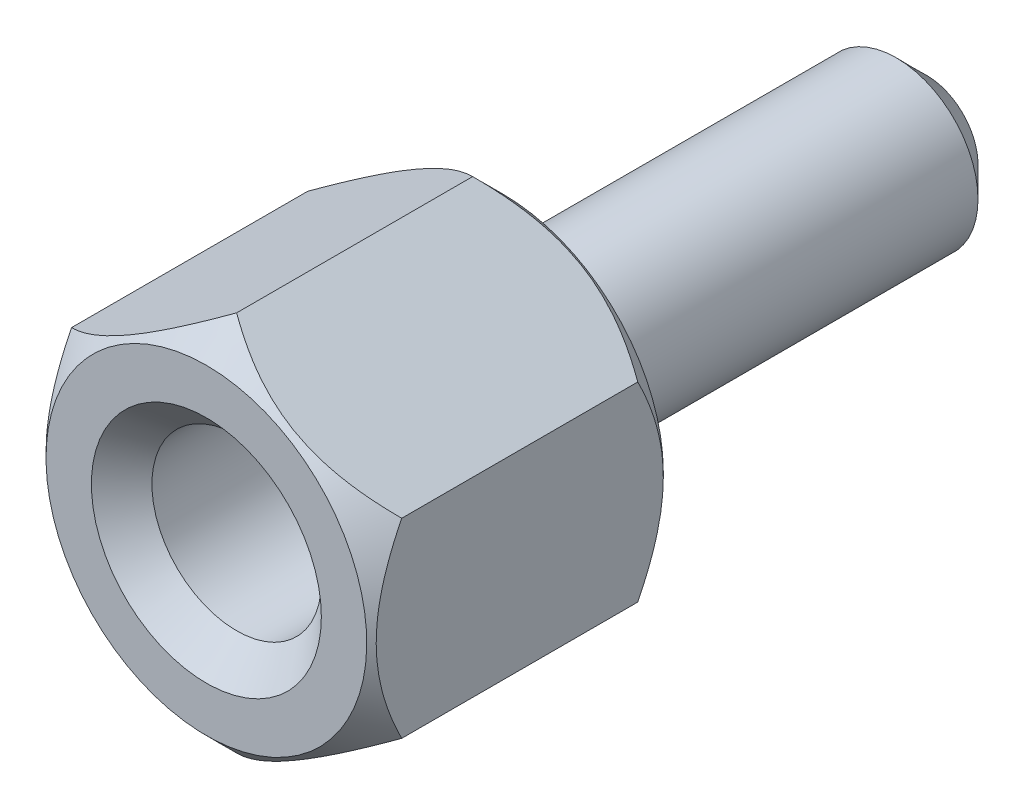
ISO-10303-21;
HEADER;
FILE_DESCRIPTION(('STEP AP214'),'2;1');
FILE_NAME('part.step','',(''),(''),'','','');
FILE_SCHEMA(('AUTOMOTIVE_DESIGN { 1 0 10303 214 1 1 1 1 }'));
ENDSEC;
DATA;
#1=APPLICATION_CONTEXT('core data for automotive mechanical design processes');
#2=APPLICATION_PROTOCOL_DEFINITION('international standard','automotive_design',2000,#1);
#3=PRODUCT_CONTEXT('',#1,'mechanical');
#4=PRODUCT('Part','Part','',(#3));
#5=PRODUCT_RELATED_PRODUCT_CATEGORY('part','',(#4));
#6=PRODUCT_DEFINITION_FORMATION('','',#4);
#7=PRODUCT_DEFINITION_CONTEXT('part definition',#1,'design');
#8=PRODUCT_DEFINITION('design','',#6,#7);
#9=PRODUCT_DEFINITION_SHAPE('','',#8);
#10=(LENGTH_UNIT() NAMED_UNIT(*) SI_UNIT(.MILLI.,.METRE.));
#11=(NAMED_UNIT(*) PLANE_ANGLE_UNIT() SI_UNIT($,.RADIAN.));
#12=(NAMED_UNIT(*) SI_UNIT($,.STERADIAN.) SOLID_ANGLE_UNIT());
#13=UNCERTAINTY_MEASURE_WITH_UNIT(LENGTH_MEASURE(1.E-05),#10,'distance_accuracy_value','');
#14=(GEOMETRIC_REPRESENTATION_CONTEXT(3) GLOBAL_UNCERTAINTY_ASSIGNED_CONTEXT((#13)) GLOBAL_UNIT_ASSIGNED_CONTEXT((#10,
#11,#12)) REPRESENTATION_CONTEXT('',''));
#15=CARTESIAN_POINT('',(0.,0.,0.));
#16=DIRECTION('',(0.,0.,1.));
#17=DIRECTION('',(1.,0.,0.));
#18=AXIS2_PLACEMENT_3D('',#15,#16,#17);
#19=CARTESIAN_POINT('',(0.,0.,0.));
#20=DIRECTION('',(0.,0.,1.));
#21=DIRECTION('',(1.,0.,0.));
#22=AXIS2_PLACEMENT_3D('',#19,#20,#21);
#23=PLANE('',#22);
#24=CARTESIAN_POINT('',(0.,0.,0.));
#25=DIRECTION('',(0.,0.,-1.));
#26=DIRECTION('',(0.,1.,0.));
#27=AXIS2_PLACEMENT_3D('',#24,#25,#26);
#28=CIRCLE('',#27,2.65000000000002);
#29=CARTESIAN_POINT('',(0.,2.65000000000002,0.));
#30=VERTEX_POINT('',#29);
#31=EDGE_CURVE('E93',#30,#30,#28,.T.);
#32=ORIENTED_EDGE('',*,*,#31,.T.);
#33=EDGE_LOOP('',(#32));
#34=FACE_BOUND('',#33,.T.);
#35=CARTESIAN_POINT('',(0.,0.,0.));
#36=DIRECTION('',(0.,0.,1.));
#37=DIRECTION('',(1.,0.,0.));
#38=AXIS2_PLACEMENT_3D('',#35,#36,#37);
#39=CIRCLE('',#38,1.35);
#40=CARTESIAN_POINT('',(1.35,0.,0.));
#41=VERTEX_POINT('',#40);
#42=EDGE_CURVE('E122',#41,#41,#39,.F.);
#43=ORIENTED_EDGE('',*,*,#42,.F.);
#44=EDGE_LOOP('',(#43));
#45=FACE_BOUND('',#44,.T.);
#46=ADVANCED_FACE('F34',(#34,#45),#23,.F.);
#47=CARTESIAN_POINT('',(0.,3.15000000000002,4.9));
#48=DIRECTION('',(0.5,-0.866025403784438,0.));
#49=DIRECTION('',(0.866025403784438,0.5,0.));
#50=AXIS2_PLACEMENT_3D('',#47,#48,#49);
#51=PLANE('',#50);
#52=DIRECTION('',(0.,0.,-1.));
#53=VECTOR('',#52,1.);
#54=CARTESIAN_POINT('',(0.,3.15000000000002,4.9));
#55=LINE('',#54,#53);
#56=CARTESIAN_POINT('',(0.,3.15000000000002,4.4));
#57=VERTEX_POINT('',#56);
#58=CARTESIAN_POINT('',(0.,3.15000000000002,0.5));
#59=VERTEX_POINT('',#58);
#60=EDGE_CURVE('E106',#57,#59,#55,.T.);
#61=ORIENTED_EDGE('',*,*,#60,.T.);
#62=CARTESIAN_POINT('',(0.00020000000000003,3.15011547005385,0.500115476402811));
#63=CARTESIAN_POINT('',(-0.0935740623371885,3.09597498992047,0.446021054080894));
#64=CARTESIAN_POINT('',(-0.188916150852356,3.04092920945114,0.395103669921844));
#65=CARTESIAN_POINT('',(-0.383329160515754,2.92868480598801,0.301875142945967));
#66=CARTESIAN_POINT('',(-0.482418570844896,2.87147550826064,0.259615872312243));
#67=CARTESIAN_POINT('',(-0.682227636576049,2.75611569037423,0.187224912910998));
#68=CARTESIAN_POINT('',(-0.782896405789651,2.69799454936977,0.156911272084789));
#69=CARTESIAN_POINT('',(-0.986450140595693,2.58047274578495,0.11020681833911));
#70=CARTESIAN_POINT('',(-1.08932888791324,2.52107567332727,0.0937811418598558));
#71=CARTESIAN_POINT('',(-1.2666352001601,2.41870782622253,0.0789609255313397));
#72=CARTESIAN_POINT('',(-1.34083370477252,2.37586929961107,0.0767670683546481));
#73=CARTESIAN_POINT('',(-1.48910942261416,2.29026227400092,0.0804631789150768));
#74=CARTESIAN_POINT('',(-1.56318658420821,2.2474938048138,0.0863559806392811));
#75=CARTESIAN_POINT('',(-1.71064144077121,2.16236070368383,0.105890071503692));
#76=CARTESIAN_POINT('',(-1.78401825978317,2.119996577475,0.119540028268319));
#77=CARTESIAN_POINT('',(-1.92950303330313,2.03600090432026,0.153839149904403));
#78=CARTESIAN_POINT('',(-2.00161108464073,1.99436930146975,0.174487778193878));
#79=CARTESIAN_POINT('',(-2.18630711212914,1.88773500028106,0.235786519883825));
#80=CARTESIAN_POINT('',(-2.29774998690544,1.8233934265297,0.281056783854008));
#81=CARTESIAN_POINT('',(-2.46161706493738,1.72878472491664,0.357479001040071));
#82=CARTESIAN_POINT('',(-2.51561859986914,1.69760692418714,0.384330222351851));
#83=CARTESIAN_POINT('',(-2.62262141055367,1.63582882263438,0.440480326653231));
#84=CARTESIAN_POINT('',(-2.67562327613271,1.60522818127476,0.46977770720925));
#85=CARTESIAN_POINT('',(-2.728180021921,1.57488452994617,0.500115476402811));
#86=B_SPLINE_CURVE_WITH_KNOTS('',3,(#62,#63,#64,#65,#66,#67,#68,#69,#70,#71,#72,#73,#74,#75,#76,
#77,#78,#79,#80,#81,#82,#83,#84,#85),.UNSPECIFIED.,.F.,.F.,(4,2,2,2,2,2,2,2,2,2,2,4),(0.,
0.363375135570575,0.728867451458775,1.08855497791733,1.44733686140353,1.70408836341067,
1.96092986751869,2.21805892488537,2.47516827285128,2.88355283411653,3.08719139751492,
3.29070579322517),.UNSPECIFIED.);
#87=CARTESIAN_POINT('',(-2.727980021921,1.57500000000001,0.5));
#88=VERTEX_POINT('',#87);
#89=EDGE_CURVE('E49',#59,#88,#86,.T.);
#90=ORIENTED_EDGE('',*,*,#89,.T.);
#91=DIRECTION('',(0.,0.,-1.));
#92=VECTOR('',#91,1.);
#93=CARTESIAN_POINT('',(-2.727980021921,1.57500000000001,4.9));
#94=LINE('',#93,#92);
#95=CARTESIAN_POINT('',(-2.727980021921,1.57500000000001,4.4));
#96=VERTEX_POINT('',#95);
#97=EDGE_CURVE('E119',#96,#88,#94,.T.);
#98=ORIENTED_EDGE('',*,*,#97,.F.);
#99=CARTESIAN_POINT('',(-2.728180021921,1.57488452994617,4.39988452359719));
#100=CARTESIAN_POINT('',(-2.63440595958381,1.62902501007955,4.45397894591911));
#101=CARTESIAN_POINT('',(-2.53906387106864,1.68407079054888,4.50489633007816));
#102=CARTESIAN_POINT('',(-2.34465086140524,1.79631519401201,4.59812485705404));
#103=CARTESIAN_POINT('',(-2.2455614510761,1.85352449173938,4.64038412768776));
#104=CARTESIAN_POINT('',(-2.04575238534495,1.96888430962579,4.712775087089));
#105=CARTESIAN_POINT('',(-1.94508361613134,2.02700545063025,4.74308872791521));
#106=CARTESIAN_POINT('',(-1.7415298813253,2.14452725421507,4.78979318166089));
#107=CARTESIAN_POINT('',(-1.63865113400775,2.20392432667275,4.80621885814015));
#108=CARTESIAN_POINT('',(-1.4613448217609,2.3062921737775,4.82103907446866));
#109=CARTESIAN_POINT('',(-1.38714631714847,2.34913070038895,4.82323293164535));
#110=CARTESIAN_POINT('',(-1.23887059930684,2.4347377259991,4.81953682108492));
#111=CARTESIAN_POINT('',(-1.16479343771279,2.47750619518623,4.81364401936072));
#112=CARTESIAN_POINT('',(-1.01733858114978,2.5626392963162,4.79410992849631));
#113=CARTESIAN_POINT('',(-0.943961762137827,2.60500342252503,4.78045997173168));
#114=CARTESIAN_POINT('',(-0.798476988617867,2.68899909567977,4.7461608500956));
#115=CARTESIAN_POINT('',(-0.726368937280261,2.73063069853027,4.72551222180612));
#116=CARTESIAN_POINT('',(-0.541672909791851,2.83726499971896,4.66421348011618));
#117=CARTESIAN_POINT('',(-0.430230035015556,2.90160657347032,4.61894321614599));
#118=CARTESIAN_POINT('',(-0.266362956983619,2.99621527508338,4.54252099895993));
#119=CARTESIAN_POINT('',(-0.212361422051855,3.02739307581289,4.51566977764815));
#120=CARTESIAN_POINT('',(-0.105358611367328,3.08917117736564,4.45951967334677));
#121=CARTESIAN_POINT('',(-0.0523567457882833,3.11977181872526,4.43022229279075));
#122=CARTESIAN_POINT('',(0.000200000000000358,3.15011547005385,4.39988452359719));
#123=B_SPLINE_CURVE_WITH_KNOTS('',3,(#99,#100,#101,#102,#103,#104,#105,#106,#107,#108,#109,#110,
#111,#112,#113,#114,#115,#116,#117,#118,#119,#120,#121,#122),.UNSPECIFIED.,.F.,.F.,(4,2,2,2,2,2,
2,2,2,2,2,4),(0.,0.363375135570576,0.728867451458775,1.08855497791733,1.44733686140353,
1.70408836341067,1.96092986751869,2.21805892488537,2.47516827285128,2.88355283411653,
3.08719139751492,3.29070579322517),.UNSPECIFIED.);
#124=EDGE_CURVE('E110',#96,#57,#123,.T.);
#125=ORIENTED_EDGE('',*,*,#124,.T.);
#126=EDGE_LOOP('',(#61,#90,#98,#125));
#127=FACE_BOUND('',#126,.T.);
#128=ADVANCED_FACE('F145',(#127),#51,.F.);
#129=CARTESIAN_POINT('',(-2.727980021921,1.57500000000001,4.9));
#130=DIRECTION('',(1.,0.,0.));
#131=DIRECTION('',(0.,1.,0.));
#132=AXIS2_PLACEMENT_3D('',#129,#130,#131);
#133=PLANE('',#132);
#134=ORIENTED_EDGE('',*,*,#97,.T.);
#135=CARTESIAN_POINT('',(-2.72798002192099,-3.25550092627282,1.59737110233649));
#136=CARTESIAN_POINT('',(-2.72798002192099,-3.17672703612413,1.53700653490704));
#137=CARTESIAN_POINT('',(-2.72798002192099,-3.09752514985828,1.47719164655635));
#138=CARTESIAN_POINT('',(-2.72798002192099,-2.93809173414862,1.35891129956539));
#139=CARTESIAN_POINT('',(-2.72798002192099,-2.85785996255421,1.3004461676753));
#140=CARTESIAN_POINT('',(-2.72798002192099,-2.69560650241239,1.18469928265167));
#141=CARTESIAN_POINT('',(-2.72798002192099,-2.61357577511891,1.12743015823779));
#142=CARTESIAN_POINT('',(-2.72798002192099,-2.44814304631878,1.0149147294072));
#143=CARTESIAN_POINT('',(-2.72798002192099,-2.36474114029252,0.959668285000849));
#144=CARTESIAN_POINT('',(-2.72798002192099,-2.19109976112751,0.848296953107717));
#145=CARTESIAN_POINT('',(-2.72798002192099,-2.10075769177368,0.792331220040253));
#146=CARTESIAN_POINT('',(-2.72798002192099,-1.91798096628315,0.683933267187853));
#147=CARTESIAN_POINT('',(-2.72798002192099,-1.82554658564828,0.63150058576807));
#148=CARTESIAN_POINT('',(-2.72798002192099,-1.63852752147434,0.531262706573098));
#149=CARTESIAN_POINT('',(-2.72798002192099,-1.54394983520687,0.483444555778546));
#150=CARTESIAN_POINT('',(-2.72798002192099,-1.35214037256639,0.393515739329422));
#151=CARTESIAN_POINT('',(-2.72798002192099,-1.25490986351674,0.351402403766129));
#152=CARTESIAN_POINT('',(-2.72798002192099,-1.06696378795049,0.278059768498941));
#153=CARTESIAN_POINT('',(-2.72798002192099,-0.976505946767381,0.246176765984997));
#154=CARTESIAN_POINT('',(-2.72798002192099,-0.79331247640072,0.189654232666876));
#155=CARTESIAN_POINT('',(-2.72798002192099,-0.700576700219763,0.165015170658987));
#156=CARTESIAN_POINT('',(-2.72798002192099,-0.514980391634759,0.124714312550988));
#157=CARTESIAN_POINT('',(-2.72798002192099,-0.422155422993445,0.108891470856186));
#158=CARTESIAN_POINT('',(-2.72798002192099,-0.235386453927744,0.0865485765930817));
#159=CARTESIAN_POINT('',(-2.72798002192099,-0.141442680429051,0.0800266688735655));
#160=CARTESIAN_POINT('',(-2.72798002192099,0.0426636433610052,0.0768260842736425));
#161=CARTESIAN_POINT('',(-2.72798002192099,0.132819286579341,0.0797454926538971));
#162=CARTESIAN_POINT('',(-2.72798002192099,0.312412220997515,0.0943508797582278));
#163=CARTESIAN_POINT('',(-2.72798002192099,0.401849445139263,0.106037667446526));
#164=CARTESIAN_POINT('',(-2.72798002192099,0.580876065124029,0.137719778288632));
#165=CARTESIAN_POINT('',(-2.72798002192099,0.670439311219075,0.157860639965581));
#166=CARTESIAN_POINT('',(-2.72798002192099,0.847589186387221,0.20534609425834));
#167=CARTESIAN_POINT('',(-2.727980021921,0.935175939042079,0.232690235121154));
#168=CARTESIAN_POINT('',(-2.727980021921,1.20597362033415,0.327646900659197));
#169=CARTESIAN_POINT('',(-2.727980021921,1.38547850057989,0.405863405293314));
#170=CARTESIAN_POINT('',(-2.727980021921,1.64818762317084,0.536318768759621));
#171=CARTESIAN_POINT('',(-2.727980021921,1.73482752672893,0.582093890562335));
#172=CARTESIAN_POINT('',(-2.727980021921,1.90614486888383,0.677188081364419));
#173=CARTESIAN_POINT('',(-2.727980021921,1.99082265075555,0.726506524170323));
#174=CARTESIAN_POINT('',(-2.727980021921,2.15430151728724,0.82546714595397));
#175=CARTESIAN_POINT('',(-2.727980021921,2.23318618507311,0.874972807742217));
#176=CARTESIAN_POINT('',(-2.727980021921,2.3896021264157,0.976088076646995));
#177=CARTESIAN_POINT('',(-2.727980021921,2.46713329765781,1.02769784184346));
#178=CARTESIAN_POINT('',(-2.727980021921,2.62039294594431,1.13222328165579));
#179=CARTESIAN_POINT('',(-2.727980021921,2.69613090889383,1.18512510530479));
#180=CARTESIAN_POINT('',(-2.727980021921,2.84656850746406,1.29234342881317));
#181=CARTESIAN_POINT('',(-2.727980021921,2.92126842347085,1.3466595348047));
#182=CARTESIAN_POINT('',(-2.727980021921,2.99553325209797,1.4015545737932));
#183=B_SPLINE_CURVE_WITH_KNOTS('',3,(#135,#136,#137,#138,#139,#140,#141,#142,#143,#144,#145,
#146,#147,#148,#149,#150,#151,#152,#153,#154,#155,#156,#157,#158,#159,#160,#161,#162,#163,#164,
#165,#166,#167,#168,#169,#170,#171,#172,#173,#174,#175,#176,#177,#178,#179,#180,#181,#182),
.UNSPECIFIED.,.F.,.F.,(4,2,2,2,2,2,2,2,2,2,2,2,2,2,2,2,2,2,2,2,2,2,2,4),(0.,0.297735061338247,
0.595541458474167,0.895648149629961,1.19573403099282,1.51448795357474,1.83320014611212,
2.15098996951247,2.46863054653478,2.75611813717539,3.04362432866775,3.32569034264673,
3.60770008826264,3.87786531263381,4.14805546815919,4.42310121646079,4.69812971939827,
5.28373021624821,5.5776723616427,5.87156268728213,6.15092522669398,6.43030879325099,
6.70744411261773,6.98450306022675),.UNSPECIFIED.);
#184=CARTESIAN_POINT('',(-2.727980021921,-1.57500000000001,0.5));
#185=VERTEX_POINT('',#184);
#186=EDGE_CURVE('E211',#88,#185,#183,.F.);
#187=ORIENTED_EDGE('',*,*,#186,.T.);
#188=DIRECTION('',(0.,0.,-1.));
#189=VECTOR('',#188,1.);
#190=CARTESIAN_POINT('',(-2.72798002192099,-1.57500000000001,4.9));
#191=LINE('',#190,#189);
#192=CARTESIAN_POINT('',(-2.727980021921,-1.57500000000001,4.4));
#193=VERTEX_POINT('',#192);
#194=EDGE_CURVE('E116',#193,#185,#191,.T.);
#195=ORIENTED_EDGE('',*,*,#194,.F.);
#196=CARTESIAN_POINT('',(-2.72798002192099,-3.25550092627282,3.30262889766351));
#197=CARTESIAN_POINT('',(-2.72798002192099,-3.17672703612413,3.36299346509296));
#198=CARTESIAN_POINT('',(-2.72798002192099,-3.09752514985828,3.42280835344366));
#199=CARTESIAN_POINT('',(-2.72798002192099,-2.93809173414862,3.54108870043461));
#200=CARTESIAN_POINT('',(-2.72798002192099,-2.85785996255421,3.5995538323247));
#201=CARTESIAN_POINT('',(-2.72798002192099,-2.69560650241239,3.71530071734834));
#202=CARTESIAN_POINT('',(-2.72798002192099,-2.61357577511891,3.77256984176221));
#203=CARTESIAN_POINT('',(-2.72798002192099,-2.44814304631878,3.8850852705928));
#204=CARTESIAN_POINT('',(-2.72798002192099,-2.36474114029252,3.94033171499915));
#205=CARTESIAN_POINT('',(-2.72798002192099,-2.1910997611275,4.05170304689229));
#206=CARTESIAN_POINT('',(-2.72798002192099,-2.10075769177367,4.10766877995975));
#207=CARTESIAN_POINT('',(-2.72798002192099,-1.91798096628315,4.21606673281215));
#208=CARTESIAN_POINT('',(-2.72798002192099,-1.82554658564828,4.26849941423193));
#209=CARTESIAN_POINT('',(-2.72798002192099,-1.63852752147434,4.3687372934269));
#210=CARTESIAN_POINT('',(-2.72798002192099,-1.54394983520687,4.41655544422146));
#211=CARTESIAN_POINT('',(-2.72798002192099,-1.35214037256639,4.50648426067058));
#212=CARTESIAN_POINT('',(-2.72798002192099,-1.25490986351674,4.54859759623387));
#213=CARTESIAN_POINT('',(-2.72798002192099,-1.06696378795049,4.62194023150106));
#214=CARTESIAN_POINT('',(-2.72798002192099,-0.976505946767381,4.653823234015));
#215=CARTESIAN_POINT('',(-2.72798002192099,-0.793312476400719,4.71034576733313));
#216=CARTESIAN_POINT('',(-2.72798002192099,-0.700576700219762,4.73498482934101));
#217=CARTESIAN_POINT('',(-2.72798002192099,-0.514980391634758,4.77528568744901));
#218=CARTESIAN_POINT('',(-2.72798002192099,-0.422155422993445,4.79110852914382));
#219=CARTESIAN_POINT('',(-2.72798002192099,-0.235386453927743,4.81345142340692));
#220=CARTESIAN_POINT('',(-2.72798002192099,-0.14144268042905,4.81997333112644));
#221=CARTESIAN_POINT('',(-2.72798002192099,0.0426636433610055,4.82317391572636));
#222=CARTESIAN_POINT('',(-2.72798002192099,0.132819286579341,4.8202545073461));
#223=CARTESIAN_POINT('',(-2.72798002192099,0.312412220997515,4.80564912024177));
#224=CARTESIAN_POINT('',(-2.72798002192099,0.401849445139263,4.79396233255348));
#225=CARTESIAN_POINT('',(-2.72798002192099,0.580876065124029,4.76228022171137));
#226=CARTESIAN_POINT('',(-2.72798002192099,0.670439311219076,4.74213936003442));
#227=CARTESIAN_POINT('',(-2.72798002192099,0.847589186387222,4.69465390574166));
#228=CARTESIAN_POINT('',(-2.727980021921,0.935175939042079,4.66730976487885));
#229=CARTESIAN_POINT('',(-2.727980021921,1.20597362033416,4.5723530993408));
#230=CARTESIAN_POINT('',(-2.727980021921,1.38547850057989,4.49413659470669));
#231=CARTESIAN_POINT('',(-2.727980021921,1.64818762317085,4.36368123124038));
#232=CARTESIAN_POINT('',(-2.727980021921,1.73482752672893,4.31790610943766));
#233=CARTESIAN_POINT('',(-2.727980021921,1.90614486888383,4.22281191863558));
#234=CARTESIAN_POINT('',(-2.727980021921,1.99082265075555,4.17349347582968));
#235=CARTESIAN_POINT('',(-2.727980021921,2.15430151728724,4.07453285404603));
#236=CARTESIAN_POINT('',(-2.727980021921,2.23318618507311,4.02502719225778));
#237=CARTESIAN_POINT('',(-2.727980021921,2.3896021264157,3.923911923353));
#238=CARTESIAN_POINT('',(-2.727980021921,2.46713329765781,3.87230215815654));
#239=CARTESIAN_POINT('',(-2.727980021921,2.62039294594431,3.76777671834421));
#240=CARTESIAN_POINT('',(-2.727980021921,2.69613090889384,3.71487489469521));
#241=CARTESIAN_POINT('',(-2.727980021921,2.84656850746407,3.60765657118683));
#242=CARTESIAN_POINT('',(-2.727980021921,2.92126842347086,3.5533404651953));
#243=CARTESIAN_POINT('',(-2.727980021921,2.99553325209797,3.4984454262068));
#244=B_SPLINE_CURVE_WITH_KNOTS('',3,(#196,#197,#198,#199,#200,#201,#202,#203,#204,#205,#206,
#207,#208,#209,#210,#211,#212,#213,#214,#215,#216,#217,#218,#219,#220,#221,#222,#223,#224,#225,
#226,#227,#228,#229,#230,#231,#232,#233,#234,#235,#236,#237,#238,#239,#240,#241,#242,#243),
.UNSPECIFIED.,.F.,.F.,(4,2,2,2,2,2,2,2,2,2,2,2,2,2,2,2,2,2,2,2,2,2,2,4),(0.,0.297735061338247,
0.595541458474167,0.89564814962996,1.19573403099282,1.51448795357474,1.83320014611211,
2.15098996951247,2.46863054653478,2.75611813717539,3.04362432866775,3.32569034264673,
3.60770008826264,3.87786531263381,4.14805546815919,4.42310121646078,4.69812971939827,
5.28373021624821,5.5776723616427,5.87156268728213,6.15092522669398,6.43030879325099,
6.70744411261773,6.98450306022675),.UNSPECIFIED.);
#245=EDGE_CURVE('E230',#193,#96,#244,.T.);
#246=ORIENTED_EDGE('',*,*,#245,.T.);
#247=EDGE_LOOP('',(#134,#187,#195,#246));
#248=FACE_BOUND('',#247,.T.);
#249=ADVANCED_FACE('F151',(#248),#133,.F.);
#250=CARTESIAN_POINT('',(-2.72798002192099,-1.57500000000001,4.9));
#251=DIRECTION('',(0.5,0.866025403784439,0.));
#252=DIRECTION('',(-0.866025403784439,0.5,0.));
#253=AXIS2_PLACEMENT_3D('',#250,#251,#252);
#254=PLANE('',#253);
#255=ORIENTED_EDGE('',*,*,#194,.T.);
#256=CARTESIAN_POINT('',(-2.72818002192099,-1.57488452994617,0.500115476402811));
#257=CARTESIAN_POINT('',(-2.63440595958381,-1.62902501007955,0.446021054080893));
#258=CARTESIAN_POINT('',(-2.53906387106864,-1.68407079054888,0.395103669921843));
#259=CARTESIAN_POINT('',(-2.34465086140524,-1.79631519401201,0.301875142945966));
#260=CARTESIAN_POINT('',(-2.2455614510761,-1.85352449173938,0.259615872312241));
#261=CARTESIAN_POINT('',(-2.04575238534494,-1.96888430962579,0.187224912910997));
#262=CARTESIAN_POINT('',(-1.94508361613134,-2.02700545063025,0.156911272084788));
#263=CARTESIAN_POINT('',(-1.7415298813253,-2.14452725421508,0.110206818339109));
#264=CARTESIAN_POINT('',(-1.63865113400775,-2.20392432667275,0.093781141859855));
#265=CARTESIAN_POINT('',(-1.4613448217609,-2.3062921737775,0.0789609255313387));
#266=CARTESIAN_POINT('',(-1.38714631714847,-2.34913070038895,0.0767670683546471));
#267=CARTESIAN_POINT('',(-1.23887059930684,-2.4347377259991,0.0804631789150757));
#268=CARTESIAN_POINT('',(-1.16479343771279,-2.47750619518623,0.0863559806392799));
#269=CARTESIAN_POINT('',(-1.01733858114978,-2.5626392963162,0.105890071503691));
#270=CARTESIAN_POINT('',(-0.943961762137826,-2.60500342252503,0.119540028268318));
#271=CARTESIAN_POINT('',(-0.798476988617866,-2.68899909567977,0.153839149904403));
#272=CARTESIAN_POINT('',(-0.726368937280261,-2.73063069853027,0.174487778193877));
#273=CARTESIAN_POINT('',(-0.54167290979185,-2.83726499971896,0.235786519883824));
#274=CARTESIAN_POINT('',(-0.430230035015554,-2.90160657347032,0.281056783854007));
#275=CARTESIAN_POINT('',(-0.266362956983617,-2.99621527508338,0.357479001040071));
#276=CARTESIAN_POINT('',(-0.212361422051853,-3.02739307581288,0.38433022235185));
#277=CARTESIAN_POINT('',(-0.105358611367326,-3.08917117736564,0.440480326653231));
#278=CARTESIAN_POINT('',(-0.0523567457882813,-3.11977181872526,0.46977770720925));
#279=CARTESIAN_POINT('',(0.000200000000002543,-3.15011547005385,0.500115476402811));
#280=B_SPLINE_CURVE_WITH_KNOTS('',3,(#256,#257,#258,#259,#260,#261,#262,#263,#264,#265,#266,
#267,#268,#269,#270,#271,#272,#273,#274,#275,#276,#277,#278,#279),.UNSPECIFIED.,.F.,.F.,(4,2,2,
2,2,2,2,2,2,2,2,4),(0.,0.363375135570576,0.728867451458776,1.08855497791733,1.44733686140353,
1.70408836341067,1.96092986751869,2.21805892488537,2.47516827285128,2.88355283411653,
3.08719139751492,3.29070579322517),.UNSPECIFIED.);
#281=CARTESIAN_POINT('',(0.,-3.15000000000002,0.499999999999999));
#282=VERTEX_POINT('',#281);
#283=EDGE_CURVE('E204',#185,#282,#280,.T.);
#284=ORIENTED_EDGE('',*,*,#283,.T.);
#285=DIRECTION('',(0.,0.,-1.));
#286=VECTOR('',#285,1.);
#287=CARTESIAN_POINT('',(0.,-3.15000000000002,4.9));
#288=LINE('',#287,#286);
#289=CARTESIAN_POINT('',(0.,-3.15000000000002,4.4));
#290=VERTEX_POINT('',#289);
#291=EDGE_CURVE('E108',#290,#282,#288,.T.);
#292=ORIENTED_EDGE('',*,*,#291,.F.);
#293=CARTESIAN_POINT('',(0.000200000000002334,-3.15011547005385,4.39988452359719));
#294=CARTESIAN_POINT('',(-0.0935740623371869,-3.09597498992047,4.45397894591911));
#295=CARTESIAN_POINT('',(-0.188916150852355,-3.04092920945114,4.50489633007816));
#296=CARTESIAN_POINT('',(-0.383329160515752,-2.92868480598801,4.59812485705404));
#297=CARTESIAN_POINT('',(-0.482418570844895,-2.87147550826064,4.64038412768776));
#298=CARTESIAN_POINT('',(-0.682227636576048,-2.75611569037423,4.712775087089));
#299=CARTESIAN_POINT('',(-0.78289640578965,-2.69799454936977,4.74308872791521));
#300=CARTESIAN_POINT('',(-0.986450140595692,-2.58047274578495,4.78979318166089));
#301=CARTESIAN_POINT('',(-1.08932888791324,-2.52107567332727,4.80621885814015));
#302=CARTESIAN_POINT('',(-1.2666352001601,-2.41870782622253,4.82103907446866));
#303=CARTESIAN_POINT('',(-1.34083370477252,-2.37586929961107,4.82323293164535));
#304=CARTESIAN_POINT('',(-1.48910942261416,-2.29026227400092,4.81953682108493));
#305=CARTESIAN_POINT('',(-1.56318658420821,-2.2474938048138,4.81364401936072));
#306=CARTESIAN_POINT('',(-1.71064144077121,-2.16236070368383,4.79410992849631));
#307=CARTESIAN_POINT('',(-1.78401825978317,-2.119996577475,4.78045997173168));
#308=CARTESIAN_POINT('',(-1.92950303330313,-2.03600090432026,4.7461608500956));
#309=CARTESIAN_POINT('',(-2.00161108464073,-1.99436930146975,4.72551222180612));
#310=CARTESIAN_POINT('',(-2.18630711212914,-1.88773500028106,4.66421348011618));
#311=CARTESIAN_POINT('',(-2.29774998690544,-1.8233934265297,4.61894321614599));
#312=CARTESIAN_POINT('',(-2.46161706493737,-1.72878472491664,4.54252099895993));
#313=CARTESIAN_POINT('',(-2.51561859986914,-1.69760692418714,4.51566977764815));
#314=CARTESIAN_POINT('',(-2.62262141055367,-1.63582882263438,4.45951967334677));
#315=CARTESIAN_POINT('',(-2.67562327613271,-1.60522818127477,4.43022229279075));
#316=CARTESIAN_POINT('',(-2.72818002192099,-1.57488452994617,4.39988452359719));
#317=B_SPLINE_CURVE_WITH_KNOTS('',3,(#293,#294,#295,#296,#297,#298,#299,#300,#301,#302,#303,
#304,#305,#306,#307,#308,#309,#310,#311,#312,#313,#314,#315,#316),.UNSPECIFIED.,.F.,.F.,(4,2,2,
2,2,2,2,2,2,2,2,4),(0.,0.363375135570575,0.728867451458776,1.08855497791733,1.44733686140353,
1.70408836341067,1.96092986751869,2.21805892488537,2.47516827285128,2.88355283411653,
3.08719139751492,3.29070579322517),.UNSPECIFIED.);
#318=EDGE_CURVE('E237',#290,#193,#317,.T.);
#319=ORIENTED_EDGE('',*,*,#318,.T.);
#320=EDGE_LOOP('',(#255,#284,#292,#319));
#321=FACE_BOUND('',#320,.T.);
#322=ADVANCED_FACE('F224',(#321),#254,.F.);
#323=CARTESIAN_POINT('',(0.,-3.15000000000002,4.9));
#324=DIRECTION('',(-0.5,0.866025403784439,0.));
#325=DIRECTION('',(-0.866025403784439,-0.5,0.));
#326=AXIS2_PLACEMENT_3D('',#323,#324,#325);
#327=PLANE('',#326);
#328=ORIENTED_EDGE('',*,*,#291,.T.);
#329=CARTESIAN_POINT('',(-0.0001999999999977,-3.15011547005385,0.50011547640281));
#330=CARTESIAN_POINT('',(0.0935740623371906,-3.09597498992047,0.446021054080893));
#331=CARTESIAN_POINT('',(0.188916150852358,-3.04092920945114,0.395103669921843));
#332=CARTESIAN_POINT('',(0.383329160515756,-2.92868480598801,0.301875142945967));
#333=CARTESIAN_POINT('',(0.482418570844898,-2.87147550826064,0.259615872312243));
#334=CARTESIAN_POINT('',(0.68222763657605,-2.75611569037423,0.187224912910999));
#335=CARTESIAN_POINT('',(0.782896405789653,-2.69799454936977,0.156911272084789));
#336=CARTESIAN_POINT('',(0.986450140595694,-2.58047274578495,0.11020681833911));
#337=CARTESIAN_POINT('',(1.08932888791324,-2.52107567332727,0.0937811418598566));
#338=CARTESIAN_POINT('',(1.2666352001601,-2.41870782622253,0.0789609255313406));
#339=CARTESIAN_POINT('',(1.34083370477253,-2.37586929961108,0.0767670683546489));
#340=CARTESIAN_POINT('',(1.48910942261416,-2.29026227400092,0.0804631789150775));
#341=CARTESIAN_POINT('',(1.56318658420821,-2.2474938048138,0.0863559806392817));
#342=CARTESIAN_POINT('',(1.71064144077121,-2.16236070368383,0.105890071503693));
#343=CARTESIAN_POINT('',(1.78401825978317,-2.119996577475,0.11954002826832));
#344=CARTESIAN_POINT('',(1.92950303330313,-2.03600090432026,0.153839149904405));
#345=CARTESIAN_POINT('',(2.00161108464073,-1.99436930146975,0.174487778193879));
#346=CARTESIAN_POINT('',(2.18630711212914,-1.88773500028106,0.235786519883826));
#347=CARTESIAN_POINT('',(2.29774998690544,-1.8233934265297,0.281056783854009));
#348=CARTESIAN_POINT('',(2.46161706493738,-1.72878472491665,0.357479001040072));
#349=CARTESIAN_POINT('',(2.51561859986914,-1.69760692418714,0.384330222351851));
#350=CARTESIAN_POINT('',(2.62262141055367,-1.63582882263438,0.440480326653232));
#351=CARTESIAN_POINT('',(2.67562327613271,-1.60522818127477,0.469777707209251));
#352=CARTESIAN_POINT('',(2.728180021921,-1.57488452994617,0.500115476402812));
#353=B_SPLINE_CURVE_WITH_KNOTS('',3,(#329,#330,#331,#332,#333,#334,#335,#336,#337,#338,#339,
#340,#341,#342,#343,#344,#345,#346,#347,#348,#349,#350,#351,#352),.UNSPECIFIED.,.F.,.F.,(4,2,2,
2,2,2,2,2,2,2,2,4),(0.,0.363375135570575,0.728867451458773,1.08855497791733,1.44733686140352,
1.70408836341067,1.96092986751869,2.21805892488537,2.47516827285128,2.88355283411653,
3.08719139751491,3.29070579322516),.UNSPECIFIED.);
#354=CARTESIAN_POINT('',(2.727980021921,-1.57500000000001,0.5));
#355=VERTEX_POINT('',#354);
#356=EDGE_CURVE('E102',#282,#355,#353,.T.);
#357=ORIENTED_EDGE('',*,*,#356,.T.);
#358=DIRECTION('',(0.,0.,-1.));
#359=VECTOR('',#358,1.);
#360=CARTESIAN_POINT('',(2.727980021921,-1.57500000000001,4.9));
#361=LINE('',#360,#359);
#362=CARTESIAN_POINT('',(2.727980021921,-1.57500000000001,4.4));
#363=VERTEX_POINT('',#362);
#364=EDGE_CURVE('E101',#363,#355,#361,.T.);
#365=ORIENTED_EDGE('',*,*,#364,.F.);
#366=CARTESIAN_POINT('',(2.728180021921,-1.57488452994617,4.39988452359719));
#367=CARTESIAN_POINT('',(2.63440595958381,-1.62902501007955,4.45397894591911));
#368=CARTESIAN_POINT('',(2.53906387106864,-1.68407079054888,4.50489633007816));
#369=CARTESIAN_POINT('',(2.34465086140524,-1.79631519401201,4.59812485705403));
#370=CARTESIAN_POINT('',(2.2455614510761,-1.85352449173938,4.64038412768776));
#371=CARTESIAN_POINT('',(2.04575238534495,-1.96888430962579,4.712775087089));
#372=CARTESIAN_POINT('',(1.94508361613134,-2.02700545063025,4.74308872791521));
#373=CARTESIAN_POINT('',(1.7415298813253,-2.14452725421508,4.78979318166089));
#374=CARTESIAN_POINT('',(1.63865113400775,-2.20392432667275,4.80621885814014));
#375=CARTESIAN_POINT('',(1.4613448217609,-2.3062921737775,4.82103907446866));
#376=CARTESIAN_POINT('',(1.38714631714847,-2.34913070038895,4.82323293164535));
#377=CARTESIAN_POINT('',(1.23887059930684,-2.4347377259991,4.81953682108492));
#378=CARTESIAN_POINT('',(1.16479343771279,-2.47750619518623,4.81364401936072));
#379=CARTESIAN_POINT('',(1.01733858114978,-2.5626392963162,4.79410992849631));
#380=CARTESIAN_POINT('',(0.943961762137827,-2.60500342252503,4.78045997173168));
#381=CARTESIAN_POINT('',(0.798476988617866,-2.68899909567977,4.7461608500956));
#382=CARTESIAN_POINT('',(0.726368937280261,-2.73063069853028,4.72551222180612));
#383=CARTESIAN_POINT('',(0.541672909791852,-2.83726499971896,4.66421348011617));
#384=CARTESIAN_POINT('',(0.430230035015556,-2.90160657347032,4.61894321614599));
#385=CARTESIAN_POINT('',(0.26636295698362,-2.99621527508338,4.54252099895993));
#386=CARTESIAN_POINT('',(0.212361422051856,-3.02739307581289,4.51566977764815));
#387=CARTESIAN_POINT('',(0.10535861136733,-3.08917117736564,4.45951967334677));
#388=CARTESIAN_POINT('',(0.0523567457882853,-3.11977181872526,4.43022229279075));
#389=CARTESIAN_POINT('',(-0.000199999999997836,-3.15011547005385,4.39988452359719));
#390=B_SPLINE_CURVE_WITH_KNOTS('',3,(#366,#367,#368,#369,#370,#371,#372,#373,#374,#375,#376,
#377,#378,#379,#380,#381,#382,#383,#384,#385,#386,#387,#388,#389),.UNSPECIFIED.,.F.,.F.,(4,2,2,
2,2,2,2,2,2,2,2,4),(0.,0.363375135570576,0.728867451458776,1.08855497791733,1.44733686140353,
1.70408836341067,1.96092986751869,2.21805892488537,2.47516827285128,2.88355283411653,
3.08719139751491,3.29070579322516),.UNSPECIFIED.);
#391=EDGE_CURVE('E255',#363,#290,#390,.T.);
#392=ORIENTED_EDGE('',*,*,#391,.T.);
#393=EDGE_LOOP('',(#328,#357,#365,#392));
#394=FACE_BOUND('',#393,.T.);
#395=ADVANCED_FACE('F265',(#394),#327,.F.);
#396=CARTESIAN_POINT('',(2.727980021921,-1.57500000000001,4.9));
#397=DIRECTION('',(-1.,0.,0.));
#398=DIRECTION('',(0.,-1.,0.));
#399=AXIS2_PLACEMENT_3D('',#396,#397,#398);
#400=PLANE('',#399);
#401=ORIENTED_EDGE('',*,*,#364,.T.);
#402=CARTESIAN_POINT('',(2.727980021921,-3.25550092627949,1.5973711023416));
#403=CARTESIAN_POINT('',(2.727980021921,-3.1767270361306,1.53700653491195));
#404=CARTESIAN_POINT('',(2.727980021921,-3.09752514986456,1.47719164656106));
#405=CARTESIAN_POINT('',(2.727980021921,-2.93809173415452,1.35891129956971));
#406=CARTESIAN_POINT('',(2.727980021921,-2.85785996255991,1.30044616767943));
#407=CARTESIAN_POINT('',(2.727980021921,-2.6956065024177,1.1846992826554));
#408=CARTESIAN_POINT('',(2.727980021921,-2.61357577512402,1.12743015824132));
#409=CARTESIAN_POINT('',(2.727980021921,-2.44814304632349,1.01491472941034));
#410=CARTESIAN_POINT('',(2.727980021921,-2.36474114029702,0.959668285003796));
#411=CARTESIAN_POINT('',(2.727980021921,-2.19109976113157,0.848296953110258));
#412=CARTESIAN_POINT('',(2.727980021921,-2.1007576917775,0.792331220042584));
#413=CARTESIAN_POINT('',(2.727980021921,-1.91798096628649,0.683933267189773));
#414=CARTESIAN_POINT('',(2.727980021921,-1.82554658565138,0.63150058576979));
#415=CARTESIAN_POINT('',(2.727980021921,-1.63852752147694,0.531262706574434));
#416=CARTESIAN_POINT('',(2.727980021921,-1.54394983520921,0.483444555779697));
#417=CARTESIAN_POINT('',(2.727980021921,-1.35214037256822,0.393515739330228));
#418=CARTESIAN_POINT('',(2.727980021921,-1.2549098635183,0.351402403766774));
#419=CARTESIAN_POINT('',(2.727980021921,-1.06696378795194,0.278059768499473));
#420=CARTESIAN_POINT('',(2.727980021921,-0.976505946768992,0.246176765985546));
#421=CARTESIAN_POINT('',(2.727980021921,-0.79331247640267,0.189654232667427));
#422=CARTESIAN_POINT('',(2.727980021921,-0.700576700221886,0.165015170659522));
#423=CARTESIAN_POINT('',(2.727980021921,-0.514980391637222,0.124714312551452));
#424=CARTESIAN_POINT('',(2.727980021921,-0.422155422996076,0.108891470856595));
#425=CARTESIAN_POINT('',(2.727980021921,-0.235386453930705,0.0865485765933434));
#426=CARTESIAN_POINT('',(2.727980021921,-0.141442680432175,0.0800266688737339));
#427=CARTESIAN_POINT('',(2.727980021921,0.0426636433575991,0.0768260842735941));
#428=CARTESIAN_POINT('',(2.727980021921,0.132819286575815,0.0797454926537292));
#429=CARTESIAN_POINT('',(2.727980021921,0.312412220993762,0.0943508797578042));
#430=CARTESIAN_POINT('',(2.727980021921,0.401849445135404,0.106037667445966));
#431=CARTESIAN_POINT('',(2.727980021921,0.58087606511996,0.137719778287788));
#432=CARTESIAN_POINT('',(2.727980021921,0.670439311214902,0.157860639964587));
#433=CARTESIAN_POINT('',(2.727980021921,0.847589186382852,0.205346094257045));
#434=CARTESIAN_POINT('',(2.727980021921,0.935175939037616,0.232690235119707));
#435=CARTESIAN_POINT('',(2.727980021921,1.20597362032874,0.327646900657046));
#436=CARTESIAN_POINT('',(2.727980021921,1.38547850057366,0.405863405290516));
#437=CARTESIAN_POINT('',(2.727980021921,1.64818762316345,0.5363187687558));
#438=CARTESIAN_POINT('',(2.727980021921,1.73482752672115,0.582093890558162));
#439=CARTESIAN_POINT('',(2.727980021921,1.9061448688753,0.677188081359533));
#440=CARTESIAN_POINT('',(2.727980021921,1.99082265074665,0.726506524165075));
#441=CARTESIAN_POINT('',(2.727980021921,2.15430151727766,0.825467145948034));
#442=CARTESIAN_POINT('',(2.727980021921,2.23318618506323,0.874972807735957));
#443=CARTESIAN_POINT('',(2.727980021921,2.38960212640521,0.976088076640085));
#444=CARTESIAN_POINT('',(2.727980021921,2.46713329764703,1.02769784183623));
#445=CARTESIAN_POINT('',(2.727980021921,2.62039294593293,1.13222328164791));
#446=CARTESIAN_POINT('',(2.727980021921,2.69613090888216,1.18512510529659));
#447=CARTESIAN_POINT('',(2.727980021921,2.84656850745181,1.29234342880432));
#448=CARTESIAN_POINT('',(2.727980021921,2.92126842345831,1.34665953479553));
#449=CARTESIAN_POINT('',(2.727980021921,2.99553325208514,1.40155457378371));
#450=B_SPLINE_CURVE_WITH_KNOTS('',3,(#402,#403,#404,#405,#406,#407,#408,#409,#410,#411,#412,
#413,#414,#415,#416,#417,#418,#419,#420,#421,#422,#423,#424,#425,#426,#427,#428,#429,#430,#431,
#432,#433,#434,#435,#436,#437,#438,#439,#440,#441,#442,#443,#444,#445,#446,#447,#448,#449),
.UNSPECIFIED.,.F.,.F.,(4,2,2,2,2,2,2,2,2,2,2,2,2,2,2,2,2,2,2,2,2,2,2,4),(0.,0.297735061339064,
0.5955414584758,0.895648149632425,1.19573403099612,1.51448795357897,1.83320014611728,
2.15098996951857,2.4686305465418,2.75611813718192,3.04362432867379,3.32569034265232,
3.60770008826776,3.87786531263856,4.14805546816357,4.42310121646476,4.69812971940185,
5.28373021624879,5.57767236164177,5.87156268727969,6.15092522669025,6.43030879324597,
6.70744411261144,6.98450306021919),.UNSPECIFIED.);
#451=CARTESIAN_POINT('',(2.72798002192099,1.57500000000001,0.5));
#452=VERTEX_POINT('',#451);
#453=EDGE_CURVE('E87',#355,#452,#450,.T.);
#454=ORIENTED_EDGE('',*,*,#453,.T.);
#455=DIRECTION('',(0.,0.,-1.));
#456=VECTOR('',#455,1.);
#457=CARTESIAN_POINT('',(2.727980021921,1.57500000000001,4.9));
#458=LINE('',#457,#456);
#459=CARTESIAN_POINT('',(2.727980021921,1.57500000000001,4.4));
#460=VERTEX_POINT('',#459);
#461=EDGE_CURVE('E99',#460,#452,#458,.T.);
#462=ORIENTED_EDGE('',*,*,#461,.F.);
#463=CARTESIAN_POINT('',(2.727980021921,-3.25550092627949,3.3026288976584));
#464=CARTESIAN_POINT('',(2.727980021921,-3.1767270361306,3.36299346508805));
#465=CARTESIAN_POINT('',(2.727980021921,-3.09752514986456,3.42280835343894));
#466=CARTESIAN_POINT('',(2.727980021921,-2.93809173415452,3.54108870043029));
#467=CARTESIAN_POINT('',(2.727980021921,-2.85785996255991,3.59955383232057));
#468=CARTESIAN_POINT('',(2.727980021921,-2.6956065024177,3.7153007173446));
#469=CARTESIAN_POINT('',(2.727980021921,-2.61357577512402,3.77256984175868));
#470=CARTESIAN_POINT('',(2.727980021921,-2.44814304632349,3.88508527058966));
#471=CARTESIAN_POINT('',(2.727980021921,-2.36474114029702,3.9403317149962));
#472=CARTESIAN_POINT('',(2.727980021921,-2.19109976113157,4.05170304688974));
#473=CARTESIAN_POINT('',(2.727980021921,-2.1007576917775,4.10766877995742));
#474=CARTESIAN_POINT('',(2.727980021921,-1.91798096628649,4.21606673281023));
#475=CARTESIAN_POINT('',(2.727980021921,-1.82554658565138,4.26849941423021));
#476=CARTESIAN_POINT('',(2.727980021921,-1.63852752147694,4.36873729342557));
#477=CARTESIAN_POINT('',(2.727980021921,-1.54394983520921,4.4165554442203));
#478=CARTESIAN_POINT('',(2.727980021921,-1.35214037256822,4.50648426066977));
#479=CARTESIAN_POINT('',(2.727980021921,-1.2549098635183,4.54859759623323));
#480=CARTESIAN_POINT('',(2.727980021921,-1.06696378795194,4.62194023150053));
#481=CARTESIAN_POINT('',(2.727980021921,-0.976505946768992,4.65382323401445));
#482=CARTESIAN_POINT('',(2.727980021921,-0.79331247640267,4.71034576733257));
#483=CARTESIAN_POINT('',(2.727980021921,-0.700576700221886,4.73498482934048));
#484=CARTESIAN_POINT('',(2.727980021921,-0.514980391637222,4.77528568744855));
#485=CARTESIAN_POINT('',(2.727980021921,-0.422155422996076,4.79110852914341));
#486=CARTESIAN_POINT('',(2.727980021921,-0.235386453930704,4.81345142340666));
#487=CARTESIAN_POINT('',(2.727980021921,-0.141442680432174,4.81997333112627));
#488=CARTESIAN_POINT('',(2.727980021921,0.0426636433575998,4.82317391572641));
#489=CARTESIAN_POINT('',(2.727980021921,0.132819286575816,4.82025450734627));
#490=CARTESIAN_POINT('',(2.727980021921,0.312412220993763,4.8056491202422));
#491=CARTESIAN_POINT('',(2.727980021921,0.401849445135404,4.79396233255404));
#492=CARTESIAN_POINT('',(2.727980021921,0.58087606511996,4.76228022171221));
#493=CARTESIAN_POINT('',(2.727980021921,0.670439311214903,4.74213936003541));
#494=CARTESIAN_POINT('',(2.727980021921,0.847589186382852,4.69465390574296));
#495=CARTESIAN_POINT('',(2.727980021921,0.935175939037617,4.66730976488029));
#496=CARTESIAN_POINT('',(2.727980021921,1.20597362032874,4.57235309934295));
#497=CARTESIAN_POINT('',(2.727980021921,1.38547850057366,4.49413659470949));
#498=CARTESIAN_POINT('',(2.727980021921,1.64818762316345,4.3636812312442));
#499=CARTESIAN_POINT('',(2.727980021921,1.73482752672115,4.31790610944184));
#500=CARTESIAN_POINT('',(2.727980021921,1.9061448688753,4.22281191864047));
#501=CARTESIAN_POINT('',(2.727980021921,1.99082265074665,4.17349347583493));
#502=CARTESIAN_POINT('',(2.727980021921,2.15430151727766,4.07453285405197));
#503=CARTESIAN_POINT('',(2.727980021921,2.23318618506323,4.02502719226404));
#504=CARTESIAN_POINT('',(2.727980021921,2.38960212640521,3.92391192335991));
#505=CARTESIAN_POINT('',(2.727980021921,2.46713329764703,3.87230215816377));
#506=CARTESIAN_POINT('',(2.727980021921,2.62039294593293,3.76777671835209));
#507=CARTESIAN_POINT('',(2.727980021921,2.69613090888217,3.71487489470341));
#508=CARTESIAN_POINT('',(2.727980021921,2.84656850745181,3.60765657119568));
#509=CARTESIAN_POINT('',(2.727980021921,2.92126842345831,3.55334046520447));
#510=CARTESIAN_POINT('',(2.727980021921,2.99553325208514,3.49844542621629));
#511=B_SPLINE_CURVE_WITH_KNOTS('',3,(#463,#464,#465,#466,#467,#468,#469,#470,#471,#472,#473,
#474,#475,#476,#477,#478,#479,#480,#481,#482,#483,#484,#485,#486,#487,#488,#489,#490,#491,#492,
#493,#494,#495,#496,#497,#498,#499,#500,#501,#502,#503,#504,#505,#506,#507,#508,#509,#510),
.UNSPECIFIED.,.F.,.F.,(4,2,2,2,2,2,2,2,2,2,2,2,2,2,2,2,2,2,2,2,2,2,2,4),(0.,0.297735061339063,
0.5955414584758,0.895648149632425,1.19573403099612,1.51448795357897,1.83320014611728,
2.15098996951857,2.4686305465418,2.75611813718192,3.04362432867379,3.32569034265232,
3.60770008826776,3.87786531263856,4.14805546816357,4.42310121646476,4.69812971940185,
5.28373021624879,5.57767236164177,5.87156268727969,6.15092522669025,6.43030879324597,
6.70744411261144,6.9845030602192),.UNSPECIFIED.);
#512=EDGE_CURVE('E57',#460,#363,#511,.F.);
#513=ORIENTED_EDGE('',*,*,#512,.T.);
#514=EDGE_LOOP('',(#401,#454,#462,#513));
#515=FACE_BOUND('',#514,.T.);
#516=ADVANCED_FACE('F98',(#515),#400,.F.);
#517=CARTESIAN_POINT('',(2.727980021921,1.57500000000001,4.9));
#518=DIRECTION('',(-0.5,-0.866025403784439,0.));
#519=DIRECTION('',(0.866025403784439,-0.5,0.));
#520=AXIS2_PLACEMENT_3D('',#517,#518,#519);
#521=PLANE('',#520);
#522=ORIENTED_EDGE('',*,*,#461,.T.);
#523=CARTESIAN_POINT('',(2.728180021921,1.57488452994617,0.500115476402812));
#524=CARTESIAN_POINT('',(2.63440595958381,1.62902501007955,0.446021054080894));
#525=CARTESIAN_POINT('',(2.53906387106864,1.68407079054888,0.395103669921844));
#526=CARTESIAN_POINT('',(2.34465086140524,1.79631519401201,0.301875142945967));
#527=CARTESIAN_POINT('',(2.2455614510761,1.85352449173938,0.259615872312244));
#528=CARTESIAN_POINT('',(2.04575238534495,1.96888430962579,0.187224912910999));
#529=CARTESIAN_POINT('',(1.94508361613134,2.02700545063025,0.156911272084789));
#530=CARTESIAN_POINT('',(1.7415298813253,2.14452725421508,0.110206818339111));
#531=CARTESIAN_POINT('',(1.63865113400776,2.20392432667275,0.0937811418598565));
#532=CARTESIAN_POINT('',(1.4613448217609,2.3062921737775,0.0789609255313405));
#533=CARTESIAN_POINT('',(1.38714631714847,2.34913070038895,0.076767068354649));
#534=CARTESIAN_POINT('',(1.23887059930684,2.4347377259991,0.0804631789150776));
#535=CARTESIAN_POINT('',(1.16479343771279,2.47750619518623,0.0863559806392818));
#536=CARTESIAN_POINT('',(1.01733858114978,2.5626392963162,0.105890071503693));
#537=CARTESIAN_POINT('',(0.943961762137828,2.60500342252503,0.11954002826832));
#538=CARTESIAN_POINT('',(0.798476988617868,2.68899909567977,0.153839149904405));
#539=CARTESIAN_POINT('',(0.726368937280262,2.73063069853027,0.174487778193879));
#540=CARTESIAN_POINT('',(0.541672909791853,2.83726499971896,0.235786519883826));
#541=CARTESIAN_POINT('',(0.430230035015556,2.90160657347032,0.281056783854009));
#542=CARTESIAN_POINT('',(0.266362956983619,2.99621527508338,0.357479001040072));
#543=CARTESIAN_POINT('',(0.212361422051855,3.02739307581289,0.384330222351851));
#544=CARTESIAN_POINT('',(0.105358611367328,3.08917117736564,0.440480326653232));
#545=CARTESIAN_POINT('',(0.0523567457882835,3.11977181872526,0.469777707209251));
#546=CARTESIAN_POINT('',(-0.000199999999999941,3.15011547005385,0.500115476402811));
#547=B_SPLINE_CURVE_WITH_KNOTS('',3,(#523,#524,#525,#526,#527,#528,#529,#530,#531,#532,#533,
#534,#535,#536,#537,#538,#539,#540,#541,#542,#543,#544,#545,#546),.UNSPECIFIED.,.F.,.F.,(4,2,2,
2,2,2,2,2,2,2,2,4),(0.,0.363375135570576,0.728867451458775,1.08855497791733,1.44733686140353,
1.70408836341067,1.96092986751869,2.21805892488537,2.47516827285128,2.88355283411653,
3.08719139751491,3.29070579322516),.UNSPECIFIED.);
#548=EDGE_CURVE('E84',#452,#59,#547,.T.);
#549=ORIENTED_EDGE('',*,*,#548,.T.);
#550=ORIENTED_EDGE('',*,*,#60,.F.);
#551=CARTESIAN_POINT('',(-0.000199999999999998,3.15011547005385,4.39988452359719));
#552=CARTESIAN_POINT('',(0.0935740623371891,3.09597498992047,4.45397894591911));
#553=CARTESIAN_POINT('',(0.188916150852357,3.04092920945114,4.50489633007816));
#554=CARTESIAN_POINT('',(0.383329160515754,2.92868480598801,4.59812485705403));
#555=CARTESIAN_POINT('',(0.482418570844897,2.87147550826064,4.64038412768776));
#556=CARTESIAN_POINT('',(0.682227636576049,2.75611569037423,4.712775087089));
#557=CARTESIAN_POINT('',(0.782896405789652,2.69799454936977,4.74308872791521));
#558=CARTESIAN_POINT('',(0.986450140595693,2.58047274578495,4.78979318166089));
#559=CARTESIAN_POINT('',(1.08932888791324,2.52107567332727,4.80621885814014));
#560=CARTESIAN_POINT('',(1.2666352001601,2.41870782622253,4.82103907446866));
#561=CARTESIAN_POINT('',(1.34083370477253,2.37586929961108,4.82323293164535));
#562=CARTESIAN_POINT('',(1.48910942261416,2.29026227400092,4.81953682108492));
#563=CARTESIAN_POINT('',(1.56318658420821,2.2474938048138,4.81364401936072));
#564=CARTESIAN_POINT('',(1.71064144077121,2.16236070368383,4.79410992849631));
#565=CARTESIAN_POINT('',(1.78401825978317,2.119996577475,4.78045997173168));
#566=CARTESIAN_POINT('',(1.92950303330313,2.03600090432026,4.7461608500956));
#567=CARTESIAN_POINT('',(2.00161108464073,1.99436930146975,4.72551222180612));
#568=CARTESIAN_POINT('',(2.18630711212914,1.88773500028106,4.66421348011618));
#569=CARTESIAN_POINT('',(2.29774998690544,1.8233934265297,4.61894321614599));
#570=CARTESIAN_POINT('',(2.46161706493738,1.72878472491665,4.54252099895993));
#571=CARTESIAN_POINT('',(2.51561859986914,1.69760692418714,4.51566977764815));
#572=CARTESIAN_POINT('',(2.62262141055367,1.63582882263438,4.45951967334677));
#573=CARTESIAN_POINT('',(2.67562327613271,1.60522818127477,4.43022229279075));
#574=CARTESIAN_POINT('',(2.728180021921,1.57488452994617,4.39988452359719));
#575=B_SPLINE_CURVE_WITH_KNOTS('',3,(#551,#552,#553,#554,#555,#556,#557,#558,#559,#560,#561,
#562,#563,#564,#565,#566,#567,#568,#569,#570,#571,#572,#573,#574),.UNSPECIFIED.,.F.,.F.,(4,2,2,
2,2,2,2,2,2,2,2,4),(0.,0.363375135570575,0.728867451458774,1.08855497791733,1.44733686140353,
1.70408836341067,1.96092986751869,2.21805892488537,2.47516827285128,2.88355283411653,
3.08719139751491,3.29070579322516),.UNSPECIFIED.);
#576=EDGE_CURVE('E105',#57,#460,#575,.T.);
#577=ORIENTED_EDGE('',*,*,#576,.T.);
#578=EDGE_LOOP('',(#522,#549,#550,#577));
#579=FACE_BOUND('',#578,.T.);
#580=ADVANCED_FACE('F104',(#579),#521,.F.);
#581=CARTESIAN_POINT('',(0.,0.,4.9));
#582=DIRECTION('',(0.,0.,-1.));
#583=DIRECTION('',(0.,1.,0.));
#584=AXIS2_PLACEMENT_3D('',#581,#582,#583);
#585=CONICAL_SURFACE('',#584,2.65000000000002,0.785398163397449);
#586=CARTESIAN_POINT('',(0.,0.,4.9));
#587=DIRECTION('',(0.,0.,-1.));
#588=DIRECTION('',(0.,1.,0.));
#589=AXIS2_PLACEMENT_3D('',#586,#587,#588);
#590=CIRCLE('',#589,2.65000000000002);
#591=CARTESIAN_POINT('',(0.,2.65000000000002,4.9));
#592=VERTEX_POINT('',#591);
#593=EDGE_CURVE('E273',#592,#592,#590,.T.);
#594=ORIENTED_EDGE('',*,*,#593,.T.);
#595=EDGE_LOOP('',(#594));
#596=FACE_BOUND('',#595,.T.);
#597=ORIENTED_EDGE('',*,*,#245,.F.);
#598=ORIENTED_EDGE('',*,*,#318,.F.);
#599=ORIENTED_EDGE('',*,*,#391,.F.);
#600=ORIENTED_EDGE('',*,*,#512,.F.);
#601=ORIENTED_EDGE('',*,*,#576,.F.);
#602=ORIENTED_EDGE('',*,*,#124,.F.);
#603=EDGE_LOOP('',(#597,#598,#599,#600,#601,#602));
#604=FACE_BOUND('',#603,.T.);
#605=ADVANCED_FACE('F163',(#596,#604),#585,.T.);
#606=CARTESIAN_POINT('',(0.,0.,4.9));
#607=DIRECTION('',(0.,0.,1.));
#608=DIRECTION('',(1.,0.,0.));
#609=AXIS2_PLACEMENT_3D('',#606,#607,#608);
#610=PLANE('',#609);
#611=CARTESIAN_POINT('',(0.,0.,4.9));
#612=DIRECTION('',(0.,0.,1.));
#613=DIRECTION('',(1.,0.,0.));
#614=AXIS2_PLACEMENT_3D('',#611,#612,#613);
#615=CIRCLE('',#614,1.90000000000001);
#616=CARTESIAN_POINT('',(1.90000000000001,0.,4.9));
#617=VERTEX_POINT('',#616);
#618=EDGE_CURVE('E128',#617,#617,#615,.F.);
#619=ORIENTED_EDGE('',*,*,#618,.T.);
#620=EDGE_LOOP('',(#619));
#621=FACE_BOUND('',#620,.T.);
#622=ORIENTED_EDGE('',*,*,#593,.F.);
#623=EDGE_LOOP('',(#622));
#624=FACE_BOUND('',#623,.T.);
#625=ADVANCED_FACE('F158',(#621,#624),#610,.T.);
#626=CARTESIAN_POINT('',(0.,0.,0.5));
#627=DIRECTION('',(0.,0.,1.));
#628=DIRECTION('',(0.,-1.,0.));
#629=AXIS2_PLACEMENT_3D('',#626,#627,#628);
#630=CONICAL_SURFACE('',#629,3.15000000000002,0.785398163397448);
#631=ORIENTED_EDGE('',*,*,#31,.F.);
#632=EDGE_LOOP('',(#631));
#633=FACE_BOUND('',#632,.T.);
#634=ORIENTED_EDGE('',*,*,#548,.F.);
#635=ORIENTED_EDGE('',*,*,#453,.F.);
#636=ORIENTED_EDGE('',*,*,#356,.F.);
#637=ORIENTED_EDGE('',*,*,#283,.F.);
#638=ORIENTED_EDGE('',*,*,#186,.F.);
#639=ORIENTED_EDGE('',*,*,#89,.F.);
#640=EDGE_LOOP('',(#634,#635,#636,#637,#638,#639));
#641=FACE_BOUND('',#640,.T.);
#642=ADVANCED_FACE('F86',(#633,#641),#630,.T.);
#643=CARTESIAN_POINT('',(0.,0.,-7.));
#644=DIRECTION('',(0.,0.,1.));
#645=DIRECTION('',(1.,0.,0.));
#646=AXIS2_PLACEMENT_3D('',#643,#644,#645);
#647=CYLINDRICAL_SURFACE('',#646,1.35);
#648=CARTESIAN_POINT('',(0.,0.,-6.5));
#649=DIRECTION('',(0.,0.,-1.));
#650=DIRECTION('',(-1.,0.,0.));
#651=AXIS2_PLACEMENT_3D('',#648,#649,#650);
#652=CIRCLE('',#651,1.35);
#653=CARTESIAN_POINT('',(-1.35,0.,-6.5));
#654=VERTEX_POINT('',#653);
#655=EDGE_CURVE('E11',#654,#654,#652,.F.);
#656=ORIENTED_EDGE('',*,*,#655,.T.);
#657=EDGE_LOOP('',(#656));
#658=FACE_BOUND('',#657,.T.);
#659=ORIENTED_EDGE('',*,*,#42,.T.);
#660=EDGE_LOOP('',(#659));
#661=FACE_BOUND('',#660,.T.);
#662=ADVANCED_FACE('F189',(#658,#661),#647,.T.);
#663=CARTESIAN_POINT('',(0.,0.,-7.));
#664=DIRECTION('',(0.,0.,-1.));
#665=DIRECTION('',(-1.,0.,0.));
#666=AXIS2_PLACEMENT_3D('',#663,#664,#665);
#667=PLANE('',#666);
#668=CARTESIAN_POINT('',(0.,0.,-7.));
#669=DIRECTION('',(0.,0.,-1.));
#670=DIRECTION('',(-1.,0.,0.));
#671=AXIS2_PLACEMENT_3D('',#668,#669,#670);
#672=CIRCLE('',#671,0.849999999999998);
#673=CARTESIAN_POINT('',(-0.849999999999998,0.,-7.));
#674=VERTEX_POINT('',#673);
#675=EDGE_CURVE('E42',#674,#674,#672,.T.);
#676=ORIENTED_EDGE('',*,*,#675,.T.);
#677=EDGE_LOOP('',(#676));
#678=FACE_BOUND('',#677,.T.);
#679=ADVANCED_FACE('F133',(#678),#667,.T.);
#680=CARTESIAN_POINT('',(0.,0.,1.4));
#681=DIRECTION('',(0.,0.,1.));
#682=DIRECTION('',(1.,0.,0.));
#683=AXIS2_PLACEMENT_3D('',#680,#681,#682);
#684=CYLINDRICAL_SURFACE('',#683,1.4);
#685=CARTESIAN_POINT('',(0.,0.,4.4));
#686=DIRECTION('',(0.,0.,1.));
#687=DIRECTION('',(1.,0.,0.));
#688=AXIS2_PLACEMENT_3D('',#685,#686,#687);
#689=CIRCLE('',#688,1.4);
#690=CARTESIAN_POINT('',(1.4,0.,4.4));
#691=VERTEX_POINT('',#690);
#692=EDGE_CURVE('E125',#691,#691,#689,.T.);
#693=ORIENTED_EDGE('',*,*,#692,.T.);
#694=EDGE_LOOP('',(#693));
#695=FACE_BOUND('',#694,.T.);
#696=CARTESIAN_POINT('',(0.,0.,1.4));
#697=DIRECTION('',(0.,0.,1.));
#698=DIRECTION('',(1.,0.,0.));
#699=AXIS2_PLACEMENT_3D('',#696,#697,#698);
#700=CIRCLE('',#699,1.4);
#701=CARTESIAN_POINT('',(1.4,0.,1.4));
#702=VERTEX_POINT('',#701);
#703=EDGE_CURVE('E293',#702,#702,#700,.T.);
#704=ORIENTED_EDGE('',*,*,#703,.F.);
#705=EDGE_LOOP('',(#704));
#706=FACE_BOUND('',#705,.T.);
#707=ADVANCED_FACE('F287',(#695,#706),#684,.F.);
#708=CARTESIAN_POINT('',(0.,0.,1.4));
#709=DIRECTION('',(0.,0.,1.));
#710=DIRECTION('',(1.,0.,0.));
#711=AXIS2_PLACEMENT_3D('',#708,#709,#710);
#712=PLANE('',#711);
#713=ORIENTED_EDGE('',*,*,#703,.T.);
#714=EDGE_LOOP('',(#713));
#715=FACE_BOUND('',#714,.T.);
#716=ADVANCED_FACE('F141',(#715),#712,.T.);
#717=CARTESIAN_POINT('',(0.,0.,4.4));
#718=DIRECTION('',(0.,0.,1.));
#719=DIRECTION('',(1.,0.,0.));
#720=AXIS2_PLACEMENT_3D('',#717,#718,#719);
#721=CONICAL_SURFACE('',#720,1.4,0.785398163397448);
#722=ORIENTED_EDGE('',*,*,#618,.F.);
#723=EDGE_LOOP('',(#722));
#724=FACE_BOUND('',#723,.T.);
#725=ORIENTED_EDGE('',*,*,#692,.F.);
#726=EDGE_LOOP('',(#725));
#727=FACE_BOUND('',#726,.T.);
#728=ADVANCED_FACE('F136',(#724,#727),#721,.F.);
#729=CARTESIAN_POINT('',(0.,0.,-7.));
#730=DIRECTION('',(0.,0.,1.));
#731=DIRECTION('',(1.,0.,0.));
#732=AXIS2_PLACEMENT_3D('',#729,#730,#731);
#733=CONICAL_SURFACE('',#732,0.849999999999998,0.785398163397449);
#734=ORIENTED_EDGE('',*,*,#655,.F.);
#735=EDGE_LOOP('',(#734));
#736=FACE_BOUND('',#735,.T.);
#737=ORIENTED_EDGE('',*,*,#675,.F.);
#738=EDGE_LOOP('',(#737));
#739=FACE_BOUND('',#738,.T.);
#740=ADVANCED_FACE('F36',(#736,#739),#733,.T.);
#741=CLOSED_SHELL('',(#46,#128,#249,#322,#395,#516,#580,#605,#625,#642,#662,#679,#707,#716,#728,#740));
#742=MANIFOLD_SOLID_BREP('B2',#741);
#743=ADVANCED_BREP_SHAPE_REPRESENTATION('',(#18,#742),#14);
#744=SHAPE_DEFINITION_REPRESENTATION(#9,#743);
ENDSEC;
END-ISO-10303-21;
